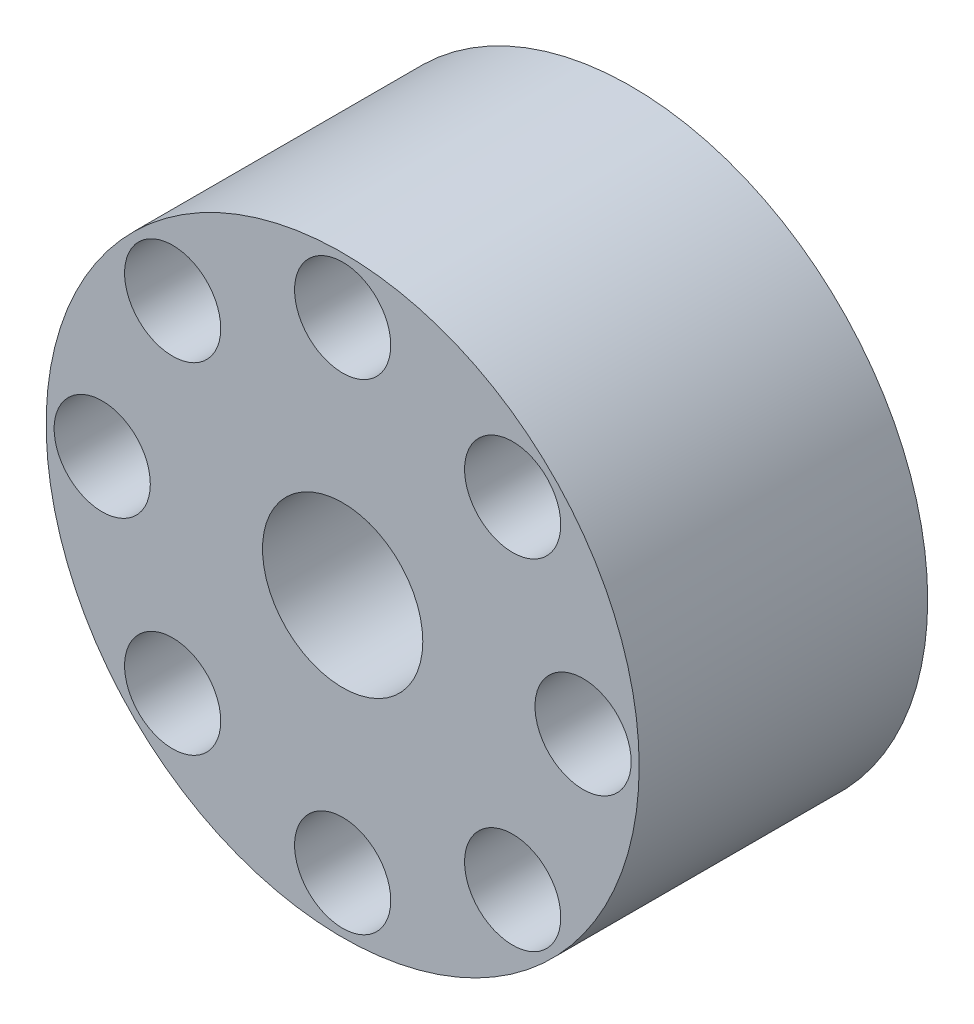
ISO-10303-21;
HEADER;
FILE_DESCRIPTION(('STEP AP214'),'2;1');
FILE_NAME('part.step','',(''),(''),'','','');
FILE_SCHEMA(('AUTOMOTIVE_DESIGN { 1 0 10303 214 1 1 1 1 }'));
ENDSEC;
DATA;
#1=APPLICATION_CONTEXT('core data for automotive mechanical design processes');
#2=APPLICATION_PROTOCOL_DEFINITION('international standard','automotive_design',2000,#1);
#3=PRODUCT_CONTEXT('',#1,'mechanical');
#4=PRODUCT('Part','Part','',(#3));
#5=PRODUCT_RELATED_PRODUCT_CATEGORY('part','',(#4));
#6=PRODUCT_DEFINITION_FORMATION('','',#4);
#7=PRODUCT_DEFINITION_CONTEXT('part definition',#1,'design');
#8=PRODUCT_DEFINITION('design','',#6,#7);
#9=PRODUCT_DEFINITION_SHAPE('','',#8);
#10=(LENGTH_UNIT() NAMED_UNIT(*) SI_UNIT(.MILLI.,.METRE.));
#11=(NAMED_UNIT(*) PLANE_ANGLE_UNIT() SI_UNIT($,.RADIAN.));
#12=(NAMED_UNIT(*) SI_UNIT($,.STERADIAN.) SOLID_ANGLE_UNIT());
#13=UNCERTAINTY_MEASURE_WITH_UNIT(LENGTH_MEASURE(1.E-05),#10,'distance_accuracy_value','');
#14=(GEOMETRIC_REPRESENTATION_CONTEXT(3) GLOBAL_UNCERTAINTY_ASSIGNED_CONTEXT((#13)) GLOBAL_UNIT_ASSIGNED_CONTEXT((#10,
#11,#12)) REPRESENTATION_CONTEXT('',''));
#15=CARTESIAN_POINT('',(0.,0.,0.));
#16=DIRECTION('',(0.,0.,1.));
#17=DIRECTION('',(1.,0.,0.));
#18=AXIS2_PLACEMENT_3D('',#15,#16,#17);
#19=CARTESIAN_POINT('',(0.,0.,18.));
#20=DIRECTION('',(0.,0.,1.));
#21=DIRECTION('',(1.,0.,0.));
#22=AXIS2_PLACEMENT_3D('',#19,#20,#21);
#23=PLANE('',#22);
#24=CARTESIAN_POINT('',(1.57116660247941E-13,15.,18.));
#25=DIRECTION('',(0.,0.,1.));
#26=DIRECTION('',(1.,0.,0.));
#27=AXIS2_PLACEMENT_3D('',#24,#25,#26);
#28=CIRCLE('',#27,3.);
#29=CARTESIAN_POINT('',(3.00000000000016,15.,18.));
#30=VERTEX_POINT('',#29);
#31=EDGE_CURVE('E83',#30,#30,#28,.T.);
#32=ORIENTED_EDGE('',*,*,#31,.F.);
#33=EDGE_LOOP('',(#32));
#34=FACE_BOUND('',#33,.T.);
#35=CARTESIAN_POINT('',(-15.,1.04744440165294E-13,18.));
#36=DIRECTION('',(0.,0.,1.));
#37=DIRECTION('',(1.,0.,0.));
#38=AXIS2_PLACEMENT_3D('',#35,#36,#37);
#39=CIRCLE('',#38,3.);
#40=CARTESIAN_POINT('',(-12.,1.04744440165294E-13,18.));
#41=VERTEX_POINT('',#40);
#42=EDGE_CURVE('E71',#41,#41,#39,.T.);
#43=ORIENTED_EDGE('',*,*,#42,.F.);
#44=EDGE_LOOP('',(#43));
#45=FACE_BOUND('',#44,.T.);
#46=CARTESIAN_POINT('',(0.,-15.,18.));
#47=DIRECTION('',(0.,0.,1.));
#48=DIRECTION('',(1.,0.,0.));
#49=AXIS2_PLACEMENT_3D('',#46,#47,#48);
#50=CIRCLE('',#49,3.);
#51=CARTESIAN_POINT('',(2.99999999999995,-15.,18.));
#52=VERTEX_POINT('',#51);
#53=EDGE_CURVE('E59',#52,#52,#50,.T.);
#54=ORIENTED_EDGE('',*,*,#53,.F.);
#55=EDGE_LOOP('',(#54));
#56=FACE_BOUND('',#55,.T.);
#57=CARTESIAN_POINT('',(0.,0.,18.));
#58=DIRECTION('',(0.,0.,1.));
#59=DIRECTION('',(1.,0.,0.));
#60=AXIS2_PLACEMENT_3D('',#57,#58,#59);
#61=CIRCLE('',#60,5.);
#62=CARTESIAN_POINT('',(5.,0.,18.));
#63=VERTEX_POINT('',#62);
#64=EDGE_CURVE('E47',#63,#63,#61,.T.);
#65=ORIENTED_EDGE('',*,*,#64,.F.);
#66=EDGE_LOOP('',(#65));
#67=FACE_BOUND('',#66,.T.);
#68=CARTESIAN_POINT('',(0.,0.,18.));
#69=DIRECTION('',(0.,0.,1.));
#70=DIRECTION('',(1.,0.,0.));
#71=AXIS2_PLACEMENT_3D('',#68,#69,#70);
#72=CIRCLE('',#71,18.5);
#73=CARTESIAN_POINT('',(18.5,0.,18.));
#74=VERTEX_POINT('',#73);
#75=EDGE_CURVE('E10',#74,#74,#72,.T.);
#76=ORIENTED_EDGE('',*,*,#75,.T.);
#77=EDGE_LOOP('',(#76));
#78=FACE_BOUND('',#77,.T.);
#79=CARTESIAN_POINT('',(15.,0.,18.));
#80=DIRECTION('',(0.,0.,1.));
#81=DIRECTION('',(1.,0.,0.));
#82=AXIS2_PLACEMENT_3D('',#79,#80,#81);
#83=CIRCLE('',#82,3.);
#84=CARTESIAN_POINT('',(18.,0.,18.));
#85=VERTEX_POINT('',#84);
#86=EDGE_CURVE('E42',#85,#85,#83,.T.);
#87=ORIENTED_EDGE('',*,*,#86,.F.);
#88=EDGE_LOOP('',(#87));
#89=FACE_BOUND('',#88,.T.);
#90=CARTESIAN_POINT('',(10.6066017177982,-10.6066017177982,18.));
#91=DIRECTION('',(0.,0.,1.));
#92=DIRECTION('',(1.,0.,0.));
#93=AXIS2_PLACEMENT_3D('',#90,#91,#92);
#94=CIRCLE('',#93,3.);
#95=CARTESIAN_POINT('',(13.6066017177982,-10.6066017177982,18.));
#96=VERTEX_POINT('',#95);
#97=EDGE_CURVE('E53',#96,#96,#94,.T.);
#98=ORIENTED_EDGE('',*,*,#97,.F.);
#99=EDGE_LOOP('',(#98));
#100=FACE_BOUND('',#99,.T.);
#101=CARTESIAN_POINT('',(-10.6066017177983,-10.6066017177982,18.));
#102=DIRECTION('',(0.,0.,1.));
#103=DIRECTION('',(1.,0.,0.));
#104=AXIS2_PLACEMENT_3D('',#101,#102,#103);
#105=CIRCLE('',#104,3.);
#106=CARTESIAN_POINT('',(-7.60660171779827,-10.6066017177982,18.));
#107=VERTEX_POINT('',#106);
#108=EDGE_CURVE('E65',#107,#107,#105,.T.);
#109=ORIENTED_EDGE('',*,*,#108,.F.);
#110=EDGE_LOOP('',(#109));
#111=FACE_BOUND('',#110,.T.);
#112=CARTESIAN_POINT('',(-10.6066017177981,10.6066017177983,18.));
#113=DIRECTION('',(0.,0.,1.));
#114=DIRECTION('',(1.,0.,0.));
#115=AXIS2_PLACEMENT_3D('',#112,#113,#114);
#116=CIRCLE('',#115,3.);
#117=CARTESIAN_POINT('',(-7.60660171779812,10.6066017177983,18.));
#118=VERTEX_POINT('',#117);
#119=EDGE_CURVE('E77',#118,#118,#116,.T.);
#120=ORIENTED_EDGE('',*,*,#119,.F.);
#121=EDGE_LOOP('',(#120));
#122=FACE_BOUND('',#121,.T.);
#123=CARTESIAN_POINT('',(10.6066017177983,10.6066017177981,18.));
#124=DIRECTION('',(0.,0.,1.));
#125=DIRECTION('',(1.,0.,0.));
#126=AXIS2_PLACEMENT_3D('',#123,#124,#125);
#127=CIRCLE('',#126,3.);
#128=CARTESIAN_POINT('',(13.6066017177983,10.6066017177981,18.));
#129=VERTEX_POINT('',#128);
#130=EDGE_CURVE('E89',#129,#129,#127,.T.);
#131=ORIENTED_EDGE('',*,*,#130,.F.);
#132=EDGE_LOOP('',(#131));
#133=FACE_BOUND('',#132,.T.);
#134=ADVANCED_FACE('F31',(#34,#45,#56,#67,#78,#89,#100,#111,#122,#133),#23,.T.);
#135=CARTESIAN_POINT('',(0.,0.,0.));
#136=DIRECTION('',(0.,0.,1.));
#137=DIRECTION('',(1.,0.,0.));
#138=AXIS2_PLACEMENT_3D('',#135,#136,#137);
#139=PLANE('',#138);
#140=CARTESIAN_POINT('',(0.,0.,0.));
#141=DIRECTION('',(0.,0.,1.));
#142=DIRECTION('',(1.,0.,0.));
#143=AXIS2_PLACEMENT_3D('',#140,#141,#142);
#144=CIRCLE('',#143,18.5);
#145=CARTESIAN_POINT('',(18.5,0.,0.));
#146=VERTEX_POINT('',#145);
#147=EDGE_CURVE('E35',#146,#146,#144,.T.);
#148=ORIENTED_EDGE('',*,*,#147,.F.);
#149=EDGE_LOOP('',(#148));
#150=FACE_BOUND('',#149,.T.);
#151=CARTESIAN_POINT('',(15.,0.,0.));
#152=DIRECTION('',(0.,0.,1.));
#153=DIRECTION('',(1.,0.,0.));
#154=AXIS2_PLACEMENT_3D('',#151,#152,#153);
#155=CIRCLE('',#154,3.);
#156=CARTESIAN_POINT('',(18.,0.,0.));
#157=VERTEX_POINT('',#156);
#158=EDGE_CURVE('E44',#157,#157,#155,.T.);
#159=ORIENTED_EDGE('',*,*,#158,.T.);
#160=EDGE_LOOP('',(#159));
#161=FACE_BOUND('',#160,.T.);
#162=CARTESIAN_POINT('',(0.,0.,0.));
#163=DIRECTION('',(0.,0.,1.));
#164=DIRECTION('',(1.,0.,0.));
#165=AXIS2_PLACEMENT_3D('',#162,#163,#164);
#166=CIRCLE('',#165,5.);
#167=CARTESIAN_POINT('',(5.,0.,0.));
#168=VERTEX_POINT('',#167);
#169=EDGE_CURVE('E50',#168,#168,#166,.T.);
#170=ORIENTED_EDGE('',*,*,#169,.T.);
#171=EDGE_LOOP('',(#170));
#172=FACE_BOUND('',#171,.T.);
#173=CARTESIAN_POINT('',(10.6066017177982,-10.6066017177982,0.));
#174=DIRECTION('',(0.,0.,1.));
#175=DIRECTION('',(1.,0.,0.));
#176=AXIS2_PLACEMENT_3D('',#173,#174,#175);
#177=CIRCLE('',#176,3.);
#178=CARTESIAN_POINT('',(13.6066017177982,-10.6066017177982,0.));
#179=VERTEX_POINT('',#178);
#180=EDGE_CURVE('E56',#179,#179,#177,.T.);
#181=ORIENTED_EDGE('',*,*,#180,.T.);
#182=EDGE_LOOP('',(#181));
#183=FACE_BOUND('',#182,.T.);
#184=CARTESIAN_POINT('',(0.,-15.,0.));
#185=DIRECTION('',(0.,0.,1.));
#186=DIRECTION('',(1.,0.,0.));
#187=AXIS2_PLACEMENT_3D('',#184,#185,#186);
#188=CIRCLE('',#187,3.);
#189=CARTESIAN_POINT('',(2.99999999999995,-15.,0.));
#190=VERTEX_POINT('',#189);
#191=EDGE_CURVE('E62',#190,#190,#188,.T.);
#192=ORIENTED_EDGE('',*,*,#191,.T.);
#193=EDGE_LOOP('',(#192));
#194=FACE_BOUND('',#193,.T.);
#195=CARTESIAN_POINT('',(-10.6066017177983,-10.6066017177982,0.));
#196=DIRECTION('',(0.,0.,1.));
#197=DIRECTION('',(1.,0.,0.));
#198=AXIS2_PLACEMENT_3D('',#195,#196,#197);
#199=CIRCLE('',#198,3.);
#200=CARTESIAN_POINT('',(-7.60660171779827,-10.6066017177982,0.));
#201=VERTEX_POINT('',#200);
#202=EDGE_CURVE('E68',#201,#201,#199,.T.);
#203=ORIENTED_EDGE('',*,*,#202,.T.);
#204=EDGE_LOOP('',(#203));
#205=FACE_BOUND('',#204,.T.);
#206=CARTESIAN_POINT('',(-15.,1.04744440165294E-13,0.));
#207=DIRECTION('',(0.,0.,1.));
#208=DIRECTION('',(1.,0.,0.));
#209=AXIS2_PLACEMENT_3D('',#206,#207,#208);
#210=CIRCLE('',#209,3.);
#211=CARTESIAN_POINT('',(-12.,1.04744440165294E-13,0.));
#212=VERTEX_POINT('',#211);
#213=EDGE_CURVE('E74',#212,#212,#210,.T.);
#214=ORIENTED_EDGE('',*,*,#213,.T.);
#215=EDGE_LOOP('',(#214));
#216=FACE_BOUND('',#215,.T.);
#217=CARTESIAN_POINT('',(-10.6066017177981,10.6066017177983,0.));
#218=DIRECTION('',(0.,0.,1.));
#219=DIRECTION('',(1.,0.,0.));
#220=AXIS2_PLACEMENT_3D('',#217,#218,#219);
#221=CIRCLE('',#220,3.);
#222=CARTESIAN_POINT('',(-7.60660171779812,10.6066017177983,0.));
#223=VERTEX_POINT('',#222);
#224=EDGE_CURVE('E80',#223,#223,#221,.T.);
#225=ORIENTED_EDGE('',*,*,#224,.T.);
#226=EDGE_LOOP('',(#225));
#227=FACE_BOUND('',#226,.T.);
#228=CARTESIAN_POINT('',(1.57116660247941E-13,15.,0.));
#229=DIRECTION('',(0.,0.,1.));
#230=DIRECTION('',(1.,0.,0.));
#231=AXIS2_PLACEMENT_3D('',#228,#229,#230);
#232=CIRCLE('',#231,3.);
#233=CARTESIAN_POINT('',(3.00000000000016,15.,0.));
#234=VERTEX_POINT('',#233);
#235=EDGE_CURVE('E86',#234,#234,#232,.T.);
#236=ORIENTED_EDGE('',*,*,#235,.T.);
#237=EDGE_LOOP('',(#236));
#238=FACE_BOUND('',#237,.T.);
#239=CARTESIAN_POINT('',(10.6066017177983,10.6066017177981,0.));
#240=DIRECTION('',(0.,0.,1.));
#241=DIRECTION('',(1.,0.,0.));
#242=AXIS2_PLACEMENT_3D('',#239,#240,#241);
#243=CIRCLE('',#242,3.);
#244=CARTESIAN_POINT('',(13.6066017177983,10.6066017177981,0.));
#245=VERTEX_POINT('',#244);
#246=EDGE_CURVE('E92',#245,#245,#243,.T.);
#247=ORIENTED_EDGE('',*,*,#246,.T.);
#248=EDGE_LOOP('',(#247));
#249=FACE_BOUND('',#248,.T.);
#250=ADVANCED_FACE('F102',(#150,#161,#172,#183,#194,#205,#216,#227,#238,#249),#139,.F.);
#251=CARTESIAN_POINT('',(0.,0.,18.));
#252=DIRECTION('',(0.,0.,-1.));
#253=DIRECTION('',(-1.,0.,0.));
#254=AXIS2_PLACEMENT_3D('',#251,#252,#253);
#255=CYLINDRICAL_SURFACE('',#254,18.5);
#256=ORIENTED_EDGE('',*,*,#75,.F.);
#257=EDGE_LOOP('',(#256));
#258=FACE_BOUND('',#257,.T.);
#259=ORIENTED_EDGE('',*,*,#147,.T.);
#260=EDGE_LOOP('',(#259));
#261=FACE_BOUND('',#260,.T.);
#262=ADVANCED_FACE('F33',(#258,#261),#255,.T.);
#263=CARTESIAN_POINT('',(15.,0.,18.));
#264=DIRECTION('',(0.,0.,-1.));
#265=DIRECTION('',(-1.,0.,0.));
#266=AXIS2_PLACEMENT_3D('',#263,#264,#265);
#267=CYLINDRICAL_SURFACE('',#266,3.);
#268=ORIENTED_EDGE('',*,*,#86,.T.);
#269=EDGE_LOOP('',(#268));
#270=FACE_BOUND('',#269,.T.);
#271=ORIENTED_EDGE('',*,*,#158,.F.);
#272=EDGE_LOOP('',(#271));
#273=FACE_BOUND('',#272,.T.);
#274=ADVANCED_FACE('F112',(#270,#273),#267,.F.);
#275=CARTESIAN_POINT('',(0.,0.,18.));
#276=DIRECTION('',(0.,0.,-1.));
#277=DIRECTION('',(-1.,0.,0.));
#278=AXIS2_PLACEMENT_3D('',#275,#276,#277);
#279=CYLINDRICAL_SURFACE('',#278,5.);
#280=ORIENTED_EDGE('',*,*,#64,.T.);
#281=EDGE_LOOP('',(#280));
#282=FACE_BOUND('',#281,.T.);
#283=ORIENTED_EDGE('',*,*,#169,.F.);
#284=EDGE_LOOP('',(#283));
#285=FACE_BOUND('',#284,.T.);
#286=ADVANCED_FACE('F115',(#282,#285),#279,.F.);
#287=CARTESIAN_POINT('',(10.6066017177982,-10.6066017177982,18.));
#288=DIRECTION('',(0.,0.,-1.));
#289=DIRECTION('',(-1.,0.,0.));
#290=AXIS2_PLACEMENT_3D('',#287,#288,#289);
#291=CYLINDRICAL_SURFACE('',#290,3.);
#292=ORIENTED_EDGE('',*,*,#97,.T.);
#293=EDGE_LOOP('',(#292));
#294=FACE_BOUND('',#293,.T.);
#295=ORIENTED_EDGE('',*,*,#180,.F.);
#296=EDGE_LOOP('',(#295));
#297=FACE_BOUND('',#296,.T.);
#298=ADVANCED_FACE('F119',(#294,#297),#291,.F.);
#299=CARTESIAN_POINT('',(0.,-15.,18.));
#300=DIRECTION('',(0.,0.,-1.));
#301=DIRECTION('',(-1.,0.,0.));
#302=AXIS2_PLACEMENT_3D('',#299,#300,#301);
#303=CYLINDRICAL_SURFACE('',#302,3.);
#304=ORIENTED_EDGE('',*,*,#53,.T.);
#305=EDGE_LOOP('',(#304));
#306=FACE_BOUND('',#305,.T.);
#307=ORIENTED_EDGE('',*,*,#191,.F.);
#308=EDGE_LOOP('',(#307));
#309=FACE_BOUND('',#308,.T.);
#310=ADVANCED_FACE('F123',(#306,#309),#303,.F.);
#311=CARTESIAN_POINT('',(-10.6066017177983,-10.6066017177982,18.));
#312=DIRECTION('',(0.,0.,-1.));
#313=DIRECTION('',(-1.,0.,0.));
#314=AXIS2_PLACEMENT_3D('',#311,#312,#313);
#315=CYLINDRICAL_SURFACE('',#314,3.);
#316=ORIENTED_EDGE('',*,*,#108,.T.);
#317=EDGE_LOOP('',(#316));
#318=FACE_BOUND('',#317,.T.);
#319=ORIENTED_EDGE('',*,*,#202,.F.);
#320=EDGE_LOOP('',(#319));
#321=FACE_BOUND('',#320,.T.);
#322=ADVANCED_FACE('F127',(#318,#321),#315,.F.);
#323=CARTESIAN_POINT('',(-15.,1.04744440165294E-13,18.));
#324=DIRECTION('',(0.,0.,-1.));
#325=DIRECTION('',(-1.,0.,0.));
#326=AXIS2_PLACEMENT_3D('',#323,#324,#325);
#327=CYLINDRICAL_SURFACE('',#326,3.);
#328=ORIENTED_EDGE('',*,*,#42,.T.);
#329=EDGE_LOOP('',(#328));
#330=FACE_BOUND('',#329,.T.);
#331=ORIENTED_EDGE('',*,*,#213,.F.);
#332=EDGE_LOOP('',(#331));
#333=FACE_BOUND('',#332,.T.);
#334=ADVANCED_FACE('F131',(#330,#333),#327,.F.);
#335=CARTESIAN_POINT('',(-10.6066017177981,10.6066017177983,18.));
#336=DIRECTION('',(0.,0.,-1.));
#337=DIRECTION('',(-1.,0.,0.));
#338=AXIS2_PLACEMENT_3D('',#335,#336,#337);
#339=CYLINDRICAL_SURFACE('',#338,3.);
#340=ORIENTED_EDGE('',*,*,#119,.T.);
#341=EDGE_LOOP('',(#340));
#342=FACE_BOUND('',#341,.T.);
#343=ORIENTED_EDGE('',*,*,#224,.F.);
#344=EDGE_LOOP('',(#343));
#345=FACE_BOUND('',#344,.T.);
#346=ADVANCED_FACE('F135',(#342,#345),#339,.F.);
#347=CARTESIAN_POINT('',(1.57116660247941E-13,15.,18.));
#348=DIRECTION('',(0.,0.,-1.));
#349=DIRECTION('',(-1.,0.,0.));
#350=AXIS2_PLACEMENT_3D('',#347,#348,#349);
#351=CYLINDRICAL_SURFACE('',#350,3.);
#352=ORIENTED_EDGE('',*,*,#31,.T.);
#353=EDGE_LOOP('',(#352));
#354=FACE_BOUND('',#353,.T.);
#355=ORIENTED_EDGE('',*,*,#235,.F.);
#356=EDGE_LOOP('',(#355));
#357=FACE_BOUND('',#356,.T.);
#358=ADVANCED_FACE('F139',(#354,#357),#351,.F.);
#359=CARTESIAN_POINT('',(10.6066017177983,10.6066017177981,18.));
#360=DIRECTION('',(0.,0.,-1.));
#361=DIRECTION('',(-1.,0.,0.));
#362=AXIS2_PLACEMENT_3D('',#359,#360,#361);
#363=CYLINDRICAL_SURFACE('',#362,3.);
#364=ORIENTED_EDGE('',*,*,#130,.T.);
#365=EDGE_LOOP('',(#364));
#366=FACE_BOUND('',#365,.T.);
#367=ORIENTED_EDGE('',*,*,#246,.F.);
#368=EDGE_LOOP('',(#367));
#369=FACE_BOUND('',#368,.T.);
#370=ADVANCED_FACE('F98',(#366,#369),#363,.F.);
#371=CLOSED_SHELL('',(#134,#250,#262,#274,#286,#298,#310,#322,#334,#346,#358,#370));
#372=MANIFOLD_SOLID_BREP('B2',#371);
#373=ADVANCED_BREP_SHAPE_REPRESENTATION('',(#18,#372),#14);
#374=SHAPE_DEFINITION_REPRESENTATION(#9,#373);
ENDSEC;
END-ISO-10303-21;
